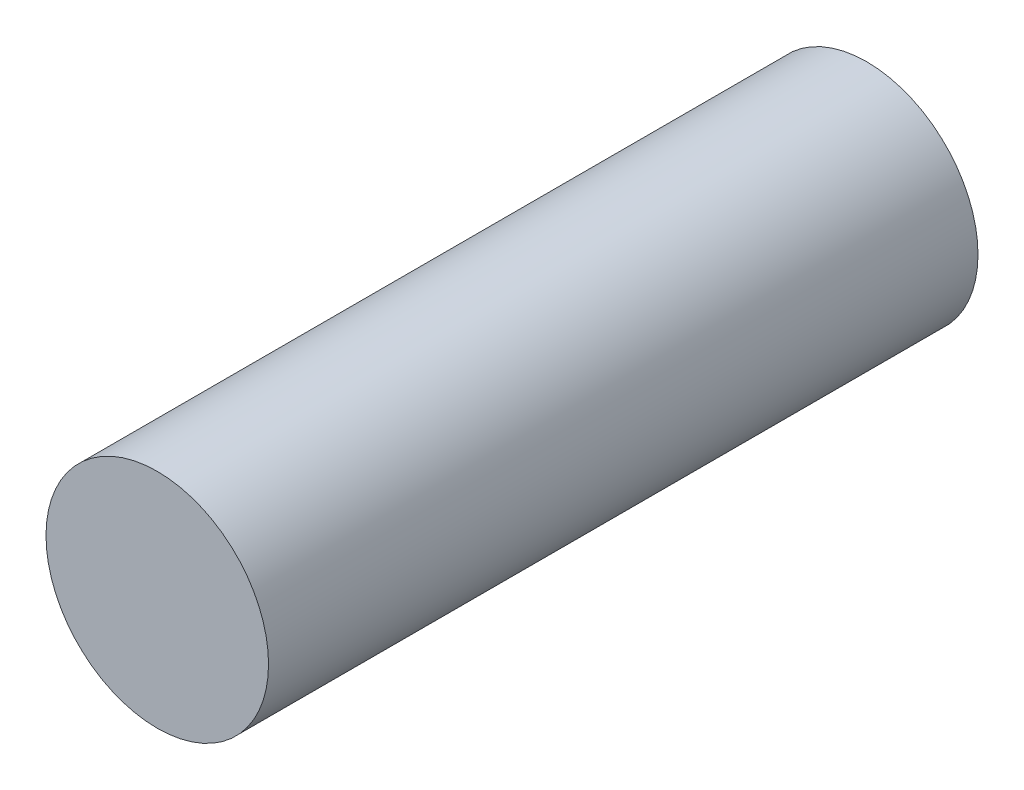
ISO-10303-21;
HEADER;
FILE_DESCRIPTION(('STEP AP214'),'2;1');
FILE_NAME('part.step','',(''),(''),'','','');
FILE_SCHEMA(('AUTOMOTIVE_DESIGN { 1 0 10303 214 1 1 1 1 }'));
ENDSEC;
DATA;
#1=APPLICATION_CONTEXT('core data for automotive mechanical design processes');
#2=APPLICATION_PROTOCOL_DEFINITION('international standard','automotive_design',2000,#1);
#3=PRODUCT_CONTEXT('',#1,'mechanical');
#4=PRODUCT('Part','Part','',(#3));
#5=PRODUCT_RELATED_PRODUCT_CATEGORY('part','',(#4));
#6=PRODUCT_DEFINITION_FORMATION('','',#4);
#7=PRODUCT_DEFINITION_CONTEXT('part definition',#1,'design');
#8=PRODUCT_DEFINITION('design','',#6,#7);
#9=PRODUCT_DEFINITION_SHAPE('','',#8);
#10=(LENGTH_UNIT() NAMED_UNIT(*) SI_UNIT(.MILLI.,.METRE.));
#11=(NAMED_UNIT(*) PLANE_ANGLE_UNIT() SI_UNIT($,.RADIAN.));
#12=(NAMED_UNIT(*) SI_UNIT($,.STERADIAN.) SOLID_ANGLE_UNIT());
#13=UNCERTAINTY_MEASURE_WITH_UNIT(LENGTH_MEASURE(1.E-05),#10,'distance_accuracy_value','');
#14=(GEOMETRIC_REPRESENTATION_CONTEXT(3) GLOBAL_UNCERTAINTY_ASSIGNED_CONTEXT((#13)) GLOBAL_UNIT_ASSIGNED_CONTEXT((#10,
#11,#12)) REPRESENTATION_CONTEXT('',''));
#15=CARTESIAN_POINT('',(0.,0.,0.));
#16=DIRECTION('',(0.,0.,1.));
#17=DIRECTION('',(1.,0.,0.));
#18=AXIS2_PLACEMENT_3D('',#15,#16,#17);
#19=CARTESIAN_POINT('',(0.,0.,62.2));
#20=DIRECTION('',(0.,0.,-1.));
#21=DIRECTION('',(-1.,0.,0.));
#22=AXIS2_PLACEMENT_3D('',#19,#20,#21);
#23=CYLINDRICAL_SURFACE('',#22,9.755);
#24=CARTESIAN_POINT('',(0.,0.,62.2));
#25=DIRECTION('',(0.,0.,1.));
#26=DIRECTION('',(1.,0.,0.));
#27=AXIS2_PLACEMENT_3D('',#24,#25,#26);
#28=CIRCLE('',#27,9.755);
#29=CARTESIAN_POINT('',(-9.755,0.,62.2));
#30=VERTEX_POINT('',#29);
#31=EDGE_CURVE('E10',#30,#30,#28,.T.);
#32=CARTESIAN_POINT('',(0.,0.,0.));
#33=DIRECTION('',(0.,0.,1.));
#34=DIRECTION('',(1.,0.,0.));
#35=AXIS2_PLACEMENT_3D('',#32,#33,#34);
#36=CIRCLE('',#35,9.755);
#37=CARTESIAN_POINT('',(-9.755,0.,0.));
#38=VERTEX_POINT('',#37);
#39=EDGE_CURVE('E39',#38,#38,#36,.T.);
#40=CARTESIAN_POINT('',(-9.755,0.,62.2));
#41=CARTESIAN_POINT('',(-9.755,0.,61.5520833333333));
#42=CARTESIAN_POINT('',(-9.755,0.,60.9041666666667));
#43=CARTESIAN_POINT('',(-9.755,0.,59.6083333333333));
#44=CARTESIAN_POINT('',(-9.755,0.,58.9604166666667));
#45=CARTESIAN_POINT('',(-9.755,0.,57.6645833333333));
#46=CARTESIAN_POINT('',(-9.755,0.,57.0166666666667));
#47=CARTESIAN_POINT('',(-9.755,0.,55.7208333333333));
#48=CARTESIAN_POINT('',(-9.755,0.,55.0729166666667));
#49=CARTESIAN_POINT('',(-9.755,0.,53.7770833333333));
#50=CARTESIAN_POINT('',(-9.755,0.,53.1291666666667));
#51=CARTESIAN_POINT('',(-9.755,0.,51.8333333333333));
#52=CARTESIAN_POINT('',(-9.755,0.,51.1854166666667));
#53=CARTESIAN_POINT('',(-9.755,0.,49.8895833333333));
#54=CARTESIAN_POINT('',(-9.755,0.,49.2416666666667));
#55=CARTESIAN_POINT('',(-9.755,0.,47.9458333333333));
#56=CARTESIAN_POINT('',(-9.755,0.,47.2979166666667));
#57=CARTESIAN_POINT('',(-9.755,0.,46.0020833333333));
#58=CARTESIAN_POINT('',(-9.755,0.,45.3541666666667));
#59=CARTESIAN_POINT('',(-9.755,0.,44.0583333333333));
#60=CARTESIAN_POINT('',(-9.755,0.,43.4104166666667));
#61=CARTESIAN_POINT('',(-9.755,0.,42.1145833333333));
#62=CARTESIAN_POINT('',(-9.755,0.,41.4666666666667));
#63=CARTESIAN_POINT('',(-9.755,0.,40.1708333333333));
#64=CARTESIAN_POINT('',(-9.755,0.,39.5229166666667));
#65=CARTESIAN_POINT('',(-9.755,0.,38.2270833333333));
#66=CARTESIAN_POINT('',(-9.755,0.,37.5791666666667));
#67=CARTESIAN_POINT('',(-9.755,0.,36.2833333333333));
#68=CARTESIAN_POINT('',(-9.755,0.,35.6354166666667));
#69=CARTESIAN_POINT('',(-9.755,0.,34.3395833333333));
#70=CARTESIAN_POINT('',(-9.755,0.,33.6916666666667));
#71=CARTESIAN_POINT('',(-9.755,0.,32.3958333333333));
#72=CARTESIAN_POINT('',(-9.755,0.,31.7479166666667));
#73=CARTESIAN_POINT('',(-9.755,0.,30.4520833333333));
#74=CARTESIAN_POINT('',(-9.755,0.,29.8041666666667));
#75=CARTESIAN_POINT('',(-9.755,0.,28.5083333333333));
#76=CARTESIAN_POINT('',(-9.755,0.,27.8604166666667));
#77=CARTESIAN_POINT('',(-9.755,0.,26.5645833333333));
#78=CARTESIAN_POINT('',(-9.755,0.,25.9166666666667));
#79=CARTESIAN_POINT('',(-9.755,0.,24.6208333333333));
#80=CARTESIAN_POINT('',(-9.755,0.,23.9729166666667));
#81=CARTESIAN_POINT('',(-9.755,0.,22.6770833333333));
#82=CARTESIAN_POINT('',(-9.755,0.,22.0291666666667));
#83=CARTESIAN_POINT('',(-9.755,0.,20.7333333333333));
#84=CARTESIAN_POINT('',(-9.755,0.,20.0854166666667));
#85=CARTESIAN_POINT('',(-9.755,0.,18.7895833333333));
#86=CARTESIAN_POINT('',(-9.755,0.,18.1416666666667));
#87=CARTESIAN_POINT('',(-9.755,0.,16.8458333333333));
#88=CARTESIAN_POINT('',(-9.755,0.,16.1979166666667));
#89=CARTESIAN_POINT('',(-9.755,0.,14.9020833333333));
#90=CARTESIAN_POINT('',(-9.755,0.,14.2541666666667));
#91=CARTESIAN_POINT('',(-9.755,0.,12.9583333333333));
#92=CARTESIAN_POINT('',(-9.755,0.,12.3104166666667));
#93=CARTESIAN_POINT('',(-9.755,0.,11.0145833333333));
#94=CARTESIAN_POINT('',(-9.755,0.,10.3666666666667));
#95=CARTESIAN_POINT('',(-9.755,0.,9.07083333333333));
#96=CARTESIAN_POINT('',(-9.755,0.,8.42291666666666));
#97=CARTESIAN_POINT('',(-9.755,0.,7.12708333333333));
#98=CARTESIAN_POINT('',(-9.755,0.,6.47916666666666));
#99=CARTESIAN_POINT('',(-9.755,0.,5.18333333333333));
#100=CARTESIAN_POINT('',(-9.755,0.,4.53541666666666));
#101=CARTESIAN_POINT('',(-9.755,0.,3.23958333333333));
#102=CARTESIAN_POINT('',(-9.755,0.,2.59166666666666));
#103=CARTESIAN_POINT('',(-9.755,0.,1.29583333333333));
#104=CARTESIAN_POINT('',(-9.755,0.,0.64791666666666));
#105=CARTESIAN_POINT('',(-9.755,0.,0.));
#106=B_SPLINE_CURVE_WITH_KNOTS('',3,(#40,#41,#42,#43,#44,#45,#46,#47,#48,#49,#50,#51,#52,#53,
#54,#55,#56,#57,#58,#59,#60,#61,#62,#63,#64,#65,#66,#67,#68,#69,#70,#71,#72,#73,#74,#75,#76,#77,
#78,#79,#80,#81,#82,#83,#84,#85,#86,#87,#88,#89,#90,#91,#92,#93,#94,#95,#96,#97,#98,#99,#100,
#101,#102,#103,#104,#105),.UNSPECIFIED.,.F.,.F.,(4,2,2,2,2,2,2,2,2,2,2,2,2,2,2,2,2,2,2,2,2,2,2,
2,2,2,2,2,2,2,2,2,4),(0.,1.94374999999999,3.8875,5.83125,7.775,9.71875,11.6625,13.60625,15.55,
17.49375,19.4375,21.38125,23.325,25.26875,27.2125,29.15625,31.1,33.04375,34.9875,36.93125,
38.875,40.81875,42.7625,44.70625,46.65,48.59375,50.5375,52.48125,54.425,56.36875,58.3125,
60.25625,62.2),.UNSPECIFIED.);
#107=EDGE_CURVE('BSEAM36',#30,#38,#106,.T.);
#108=ORIENTED_EDGE('',*,*,#31,.F.);
#109=ORIENTED_EDGE('',*,*,#39,.T.);
#110=ORIENTED_EDGE('',*,*,#107,.T.);
#111=ORIENTED_EDGE('',*,*,#107,.F.);
#112=EDGE_LOOP('',(#108,#110,#109,#111));
#113=FACE_BOUND('',#112,.T.);
#114=ADVANCED_FACE('F36',(#113),#23,.T.);
#115=CARTESIAN_POINT('',(0.,0.,62.2));
#116=DIRECTION('',(0.,0.,1.));
#117=DIRECTION('',(1.,0.,0.));
#118=AXIS2_PLACEMENT_3D('',#115,#116,#117);
#119=PLANE('',#118);
#120=ORIENTED_EDGE('',*,*,#31,.T.);
#121=EDGE_LOOP('',(#120));
#122=FACE_BOUND('',#121,.T.);
#123=ADVANCED_FACE('F51',(#122),#119,.T.);
#124=CARTESIAN_POINT('',(0.,0.,0.));
#125=DIRECTION('',(0.,0.,1.));
#126=DIRECTION('',(1.,0.,0.));
#127=AXIS2_PLACEMENT_3D('',#124,#125,#126);
#128=PLANE('',#127);
#129=ORIENTED_EDGE('',*,*,#39,.F.);
#130=EDGE_LOOP('',(#129));
#131=FACE_BOUND('',#130,.T.);
#132=ADVANCED_FACE('F49',(#131),#128,.F.);
#133=CLOSED_SHELL('',(#114,#123,#132));
#134=MANIFOLD_SOLID_BREP('B2',#133);
#135=ADVANCED_BREP_SHAPE_REPRESENTATION('',(#18,#134),#14);
#136=SHAPE_DEFINITION_REPRESENTATION(#9,#135);
ENDSEC;
END-ISO-10303-21;
